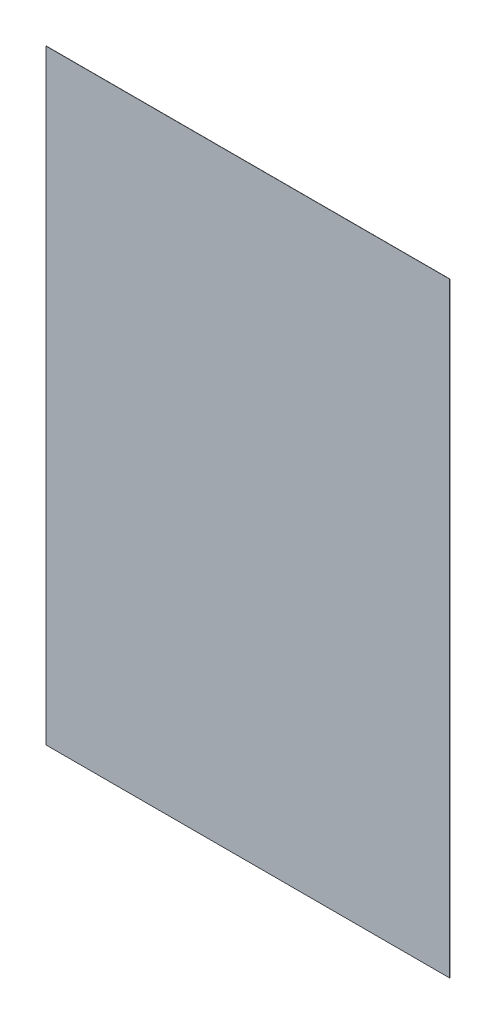
ISO-10303-21;
HEADER;
FILE_DESCRIPTION(('STEP AP214'),'2;1');
FILE_NAME('part.step','',(''),(''),'','','');
FILE_SCHEMA(('AUTOMOTIVE_DESIGN { 1 0 10303 214 1 1 1 1 }'));
ENDSEC;
DATA;
#1=APPLICATION_CONTEXT('core data for automotive mechanical design processes');
#2=APPLICATION_PROTOCOL_DEFINITION('international standard','automotive_design',2000,#1);
#3=PRODUCT_CONTEXT('',#1,'mechanical');
#4=PRODUCT('Part','Part','',(#3));
#5=PRODUCT_RELATED_PRODUCT_CATEGORY('part','',(#4));
#6=PRODUCT_DEFINITION_FORMATION('','',#4);
#7=PRODUCT_DEFINITION_CONTEXT('part definition',#1,'design');
#8=PRODUCT_DEFINITION('design','',#6,#7);
#9=PRODUCT_DEFINITION_SHAPE('','',#8);
#10=(LENGTH_UNIT() NAMED_UNIT(*) SI_UNIT(.MILLI.,.METRE.));
#11=(NAMED_UNIT(*) PLANE_ANGLE_UNIT() SI_UNIT($,.RADIAN.));
#12=(NAMED_UNIT(*) SI_UNIT($,.STERADIAN.) SOLID_ANGLE_UNIT());
#13=UNCERTAINTY_MEASURE_WITH_UNIT(LENGTH_MEASURE(1.E-05),#10,'distance_accuracy_value','');
#14=(GEOMETRIC_REPRESENTATION_CONTEXT(3) GLOBAL_UNCERTAINTY_ASSIGNED_CONTEXT((#13)) GLOBAL_UNIT_ASSIGNED_CONTEXT((#10,
#11,#12)) REPRESENTATION_CONTEXT('',''));
#15=CARTESIAN_POINT('',(0.,0.,0.));
#16=DIRECTION('',(0.,0.,1.));
#17=DIRECTION('',(1.,0.,0.));
#18=AXIS2_PLACEMENT_3D('',#15,#16,#17);
#19=CARTESIAN_POINT('',(0.,30.,0.01));
#20=DIRECTION('',(1.,0.,0.));
#21=DIRECTION('',(0.,0.,-1.));
#22=AXIS2_PLACEMENT_3D('',#19,#20,#21);
#23=PLANE('',#22);
#24=DIRECTION('',(0.,-1.,0.));
#25=VECTOR('',#24,1.);
#26=CARTESIAN_POINT('',(0.,30.,0.));
#27=LINE('',#26,#25);
#28=CARTESIAN_POINT('',(0.,30.,0.));
#29=VERTEX_POINT('',#28);
#30=CARTESIAN_POINT('',(0.,0.,0.));
#31=VERTEX_POINT('',#30);
#32=EDGE_CURVE('E106',#29,#31,#27,.T.);
#33=ORIENTED_EDGE('',*,*,#32,.T.);
#34=DIRECTION('',(0.,0.,-1.));
#35=VECTOR('',#34,1.);
#36=CARTESIAN_POINT('',(0.,0.,0.01));
#37=LINE('',#36,#35);
#38=CARTESIAN_POINT('',(0.,0.,0.01));
#39=VERTEX_POINT('',#38);
#40=EDGE_CURVE('E11',#39,#31,#37,.T.);
#41=ORIENTED_EDGE('',*,*,#40,.F.);
#42=DIRECTION('',(0.,-1.,0.));
#43=VECTOR('',#42,1.);
#44=CARTESIAN_POINT('',(0.,30.,0.01));
#45=LINE('',#44,#43);
#46=CARTESIAN_POINT('',(0.,30.,0.01));
#47=VERTEX_POINT('',#46);
#48=EDGE_CURVE('E94',#47,#39,#45,.T.);
#49=ORIENTED_EDGE('',*,*,#48,.F.);
#50=DIRECTION('',(0.,0.,-1.));
#51=VECTOR('',#50,1.);
#52=CARTESIAN_POINT('',(0.,30.,0.01));
#53=LINE('',#52,#51);
#54=EDGE_CURVE('E102',#47,#29,#53,.T.);
#55=ORIENTED_EDGE('',*,*,#54,.T.);
#56=EDGE_LOOP('',(#33,#41,#49,#55));
#57=FACE_BOUND('',#56,.T.);
#58=ADVANCED_FACE('F43',(#57),#23,.F.);
#59=CARTESIAN_POINT('',(0.,0.,0.01));
#60=DIRECTION('',(0.,1.,0.));
#61=DIRECTION('',(0.,0.,1.));
#62=AXIS2_PLACEMENT_3D('',#59,#60,#61);
#63=PLANE('',#62);
#64=DIRECTION('',(1.,0.,0.));
#65=VECTOR('',#64,1.);
#66=CARTESIAN_POINT('',(0.,0.,0.));
#67=LINE('',#66,#65);
#68=CARTESIAN_POINT('',(20.,0.,0.));
#69=VERTEX_POINT('',#68);
#70=EDGE_CURVE('E98',#31,#69,#67,.T.);
#71=ORIENTED_EDGE('',*,*,#70,.T.);
#72=DIRECTION('',(0.,0.,-1.));
#73=VECTOR('',#72,1.);
#74=CARTESIAN_POINT('',(20.,0.,0.01));
#75=LINE('',#74,#73);
#76=CARTESIAN_POINT('',(20.,0.,0.01));
#77=VERTEX_POINT('',#76);
#78=EDGE_CURVE('E51',#77,#69,#75,.T.);
#79=ORIENTED_EDGE('',*,*,#78,.F.);
#80=DIRECTION('',(1.,0.,0.));
#81=VECTOR('',#80,1.);
#82=CARTESIAN_POINT('',(0.,0.,0.01));
#83=LINE('',#82,#81);
#84=EDGE_CURVE('E89',#39,#77,#83,.T.);
#85=ORIENTED_EDGE('',*,*,#84,.F.);
#86=ORIENTED_EDGE('',*,*,#40,.T.);
#87=EDGE_LOOP('',(#71,#79,#85,#86));
#88=FACE_BOUND('',#87,.T.);
#89=ADVANCED_FACE('F97',(#88),#63,.F.);
#90=CARTESIAN_POINT('',(20.,0.,0.01));
#91=DIRECTION('',(-1.,0.,0.));
#92=DIRECTION('',(0.,0.,1.));
#93=AXIS2_PLACEMENT_3D('',#90,#91,#92);
#94=PLANE('',#93);
#95=DIRECTION('',(0.,1.,0.));
#96=VECTOR('',#95,1.);
#97=CARTESIAN_POINT('',(20.,0.,0.));
#98=LINE('',#97,#96);
#99=CARTESIAN_POINT('',(20.,30.,0.));
#100=VERTEX_POINT('',#99);
#101=EDGE_CURVE('E76',#69,#100,#98,.T.);
#102=ORIENTED_EDGE('',*,*,#101,.T.);
#103=DIRECTION('',(0.,0.,-1.));
#104=VECTOR('',#103,1.);
#105=CARTESIAN_POINT('',(20.,30.,0.01));
#106=LINE('',#105,#104);
#107=CARTESIAN_POINT('',(20.,30.,0.01));
#108=VERTEX_POINT('',#107);
#109=EDGE_CURVE('E99',#108,#100,#106,.T.);
#110=ORIENTED_EDGE('',*,*,#109,.F.);
#111=DIRECTION('',(0.,1.,0.));
#112=VECTOR('',#111,1.);
#113=CARTESIAN_POINT('',(20.,0.,0.01));
#114=LINE('',#113,#112);
#115=EDGE_CURVE('E92',#77,#108,#114,.T.);
#116=ORIENTED_EDGE('',*,*,#115,.F.);
#117=ORIENTED_EDGE('',*,*,#78,.T.);
#118=EDGE_LOOP('',(#102,#110,#116,#117));
#119=FACE_BOUND('',#118,.T.);
#120=ADVANCED_FACE('F100',(#119),#94,.F.);
#121=CARTESIAN_POINT('',(20.,30.,0.01));
#122=DIRECTION('',(0.,-1.,0.));
#123=DIRECTION('',(0.,0.,-1.));
#124=AXIS2_PLACEMENT_3D('',#121,#122,#123);
#125=PLANE('',#124);
#126=DIRECTION('',(-1.,0.,0.));
#127=VECTOR('',#126,1.);
#128=CARTESIAN_POINT('',(20.,30.,0.));
#129=LINE('',#128,#127);
#130=EDGE_CURVE('E82',#100,#29,#129,.T.);
#131=ORIENTED_EDGE('',*,*,#130,.T.);
#132=ORIENTED_EDGE('',*,*,#54,.F.);
#133=DIRECTION('',(-1.,0.,0.));
#134=VECTOR('',#133,1.);
#135=CARTESIAN_POINT('',(20.,30.,0.01));
#136=LINE('',#135,#134);
#137=EDGE_CURVE('E59',#108,#47,#136,.T.);
#138=ORIENTED_EDGE('',*,*,#137,.F.);
#139=ORIENTED_EDGE('',*,*,#109,.T.);
#140=EDGE_LOOP('',(#131,#132,#138,#139));
#141=FACE_BOUND('',#140,.T.);
#142=ADVANCED_FACE('F113',(#141),#125,.F.);
#143=CARTESIAN_POINT('',(0.,0.,0.01));
#144=DIRECTION('',(0.,0.,1.));
#145=DIRECTION('',(1.,0.,0.));
#146=AXIS2_PLACEMENT_3D('',#143,#144,#145);
#147=PLANE('',#146);
#148=ORIENTED_EDGE('',*,*,#48,.T.);
#149=ORIENTED_EDGE('',*,*,#84,.T.);
#150=ORIENTED_EDGE('',*,*,#115,.T.);
#151=ORIENTED_EDGE('',*,*,#137,.T.);
#152=EDGE_LOOP('',(#148,#149,#150,#151));
#153=FACE_BOUND('',#152,.T.);
#154=ADVANCED_FACE('F90',(#153),#147,.T.);
#155=CARTESIAN_POINT('',(0.,0.,0.));
#156=DIRECTION('',(0.,0.,1.));
#157=DIRECTION('',(1.,0.,0.));
#158=AXIS2_PLACEMENT_3D('',#155,#156,#157);
#159=PLANE('',#158);
#160=ORIENTED_EDGE('',*,*,#32,.F.);
#161=ORIENTED_EDGE('',*,*,#130,.F.);
#162=ORIENTED_EDGE('',*,*,#101,.F.);
#163=ORIENTED_EDGE('',*,*,#70,.F.);
#164=EDGE_LOOP('',(#160,#161,#162,#163));
#165=FACE_BOUND('',#164,.T.);
#166=ADVANCED_FACE('F116',(#165),#159,.F.);
#167=CLOSED_SHELL('',(#58,#89,#120,#142,#154,#166));
#168=MANIFOLD_SOLID_BREP('B2',#167);
#169=ADVANCED_BREP_SHAPE_REPRESENTATION('',(#18,#168),#14);
#170=SHAPE_DEFINITION_REPRESENTATION(#9,#169);
ENDSEC;
END-ISO-10303-21;
